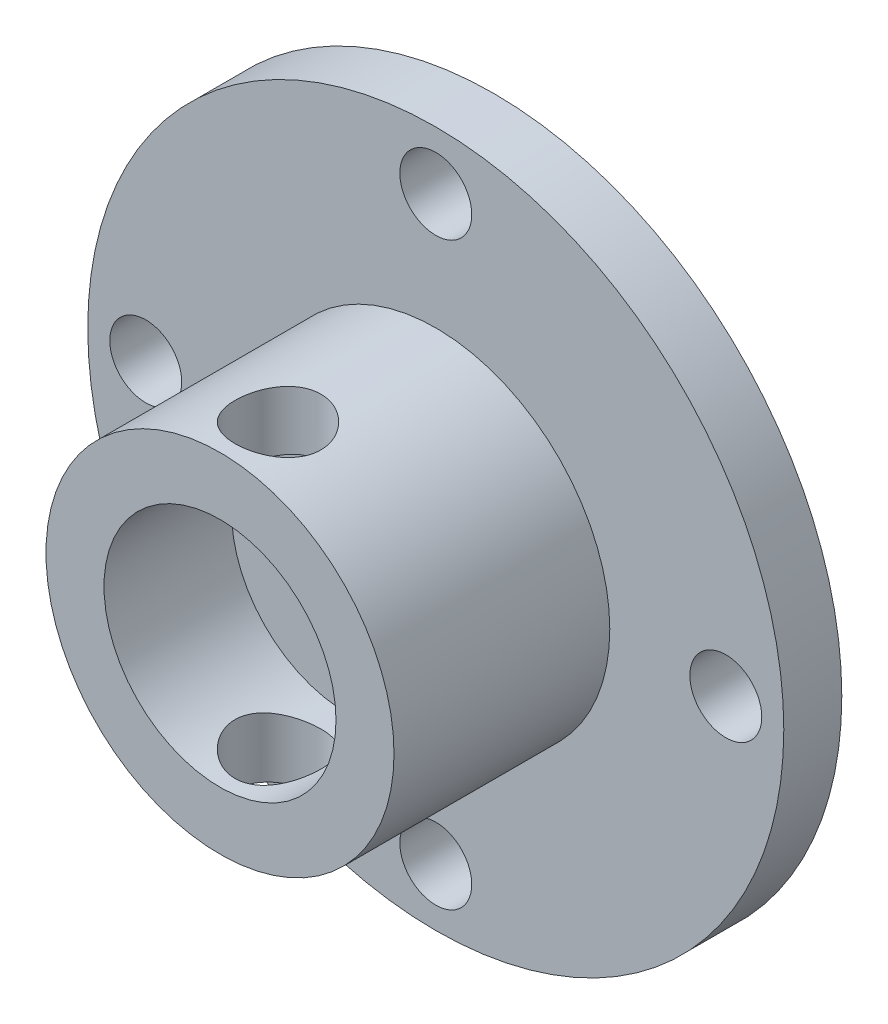
ISO-10303-21;
HEADER;
FILE_DESCRIPTION(('STEP AP214'),'2;1');
FILE_NAME('part.step','',(''),(''),'','','');
FILE_SCHEMA(('AUTOMOTIVE_DESIGN { 1 0 10303 214 1 1 1 1 }'));
ENDSEC;
DATA;
#1=APPLICATION_CONTEXT('core data for automotive mechanical design processes');
#2=APPLICATION_PROTOCOL_DEFINITION('international standard','automotive_design',2000,#1);
#3=PRODUCT_CONTEXT('',#1,'mechanical');
#4=PRODUCT('Part','Part','',(#3));
#5=PRODUCT_RELATED_PRODUCT_CATEGORY('part','',(#4));
#6=PRODUCT_DEFINITION_FORMATION('','',#4);
#7=PRODUCT_DEFINITION_CONTEXT('part definition',#1,'design');
#8=PRODUCT_DEFINITION('design','',#6,#7);
#9=PRODUCT_DEFINITION_SHAPE('','',#8);
#10=(LENGTH_UNIT() NAMED_UNIT(*) SI_UNIT(.MILLI.,.METRE.));
#11=(NAMED_UNIT(*) PLANE_ANGLE_UNIT() SI_UNIT($,.RADIAN.));
#12=(NAMED_UNIT(*) SI_UNIT($,.STERADIAN.) SOLID_ANGLE_UNIT());
#13=UNCERTAINTY_MEASURE_WITH_UNIT(LENGTH_MEASURE(1.E-05),#10,'distance_accuracy_value','');
#14=(GEOMETRIC_REPRESENTATION_CONTEXT(3) GLOBAL_UNCERTAINTY_ASSIGNED_CONTEXT((#13)) GLOBAL_UNIT_ASSIGNED_CONTEXT((#10,
#11,#12)) REPRESENTATION_CONTEXT('',''));
#15=CARTESIAN_POINT('',(0.,0.,0.));
#16=DIRECTION('',(0.,0.,1.));
#17=DIRECTION('',(1.,0.,0.));
#18=AXIS2_PLACEMENT_3D('',#15,#16,#17);
#19=CARTESIAN_POINT('',(0.,0.,0.));
#20=DIRECTION('',(0.,0.,1.));
#21=DIRECTION('',(1.,0.,0.));
#22=AXIS2_PLACEMENT_3D('',#19,#20,#21);
#23=CYLINDRICAL_SURFACE('',#22,2.5);
#24=CARTESIAN_POINT('',(0.,0.,0.));
#25=DIRECTION('',(0.,0.,1.));
#26=DIRECTION('',(1.,0.,0.));
#27=AXIS2_PLACEMENT_3D('',#24,#25,#26);
#28=CIRCLE('',#27,2.5);
#29=CARTESIAN_POINT('',(2.5,0.,0.));
#30=VERTEX_POINT('',#29);
#31=EDGE_CURVE('E65',#30,#30,#28,.T.);
#32=ORIENTED_EDGE('',*,*,#31,.F.);
#33=EDGE_LOOP('',(#32));
#34=FACE_BOUND('',#33,.T.);
#35=CARTESIAN_POINT('',(0.,0.,6.3));
#36=DIRECTION('',(0.,0.,1.));
#37=DIRECTION('',(1.,0.,0.));
#38=AXIS2_PLACEMENT_3D('',#35,#36,#37);
#39=CIRCLE('',#38,2.5);
#40=CARTESIAN_POINT('',(2.5,0.,6.3));
#41=VERTEX_POINT('',#40);
#42=EDGE_CURVE('E62',#41,#41,#39,.F.);
#43=ORIENTED_EDGE('',*,*,#42,.F.);
#44=EDGE_LOOP('',(#43));
#45=FACE_BOUND('',#44,.T.);
#46=ADVANCED_FACE('F35',(#34,#45),#23,.F.);
#47=CARTESIAN_POINT('',(0.,0.,2.5));
#48=DIRECTION('',(0.,0.,1.));
#49=DIRECTION('',(1.,0.,0.));
#50=AXIS2_PLACEMENT_3D('',#47,#48,#49);
#51=PLANE('',#50);
#52=CARTESIAN_POINT('',(0.,0.,2.5));
#53=DIRECTION('',(0.,0.,1.));
#54=DIRECTION('',(1.,0.,0.));
#55=AXIS2_PLACEMENT_3D('',#52,#53,#54);
#56=CIRCLE('',#55,7.5);
#57=CARTESIAN_POINT('',(7.5,0.,2.5));
#58=VERTEX_POINT('',#57);
#59=EDGE_CURVE('E164',#58,#58,#56,.T.);
#60=ORIENTED_EDGE('',*,*,#59,.F.);
#61=EDGE_LOOP('',(#60));
#62=FACE_BOUND('',#61,.T.);
#63=CARTESIAN_POINT('',(0.,-12.5,2.5));
#64=DIRECTION('',(0.,0.,1.));
#65=DIRECTION('',(1.,0.,0.));
#66=AXIS2_PLACEMENT_3D('',#63,#64,#65);
#67=CIRCLE('',#66,1.55);
#68=CARTESIAN_POINT('',(1.55,-12.5,2.5));
#69=VERTEX_POINT('',#68);
#70=EDGE_CURVE('E178',#69,#69,#67,.T.);
#71=ORIENTED_EDGE('',*,*,#70,.F.);
#72=EDGE_LOOP('',(#71));
#73=FACE_BOUND('',#72,.T.);
#74=CARTESIAN_POINT('',(0.,12.5,2.5));
#75=DIRECTION('',(0.,0.,1.));
#76=DIRECTION('',(1.,0.,0.));
#77=AXIS2_PLACEMENT_3D('',#74,#75,#76);
#78=CIRCLE('',#77,1.55);
#79=CARTESIAN_POINT('',(1.55,12.5,2.5));
#80=VERTEX_POINT('',#79);
#81=EDGE_CURVE('E56',#80,#80,#78,.T.);
#82=ORIENTED_EDGE('',*,*,#81,.F.);
#83=EDGE_LOOP('',(#82));
#84=FACE_BOUND('',#83,.T.);
#85=CARTESIAN_POINT('',(0.,0.,2.5));
#86=DIRECTION('',(0.,0.,1.));
#87=DIRECTION('',(1.,0.,0.));
#88=AXIS2_PLACEMENT_3D('',#85,#86,#87);
#89=CIRCLE('',#88,15.);
#90=CARTESIAN_POINT('',(15.,0.,2.5));
#91=VERTEX_POINT('',#90);
#92=EDGE_CURVE('E10',#91,#91,#89,.T.);
#93=ORIENTED_EDGE('',*,*,#92,.T.);
#94=EDGE_LOOP('',(#93));
#95=FACE_BOUND('',#94,.T.);
#96=CARTESIAN_POINT('',(12.5,0.,2.5));
#97=DIRECTION('',(0.,0.,1.));
#98=DIRECTION('',(1.,0.,0.));
#99=AXIS2_PLACEMENT_3D('',#96,#97,#98);
#100=CIRCLE('',#99,1.55);
#101=CARTESIAN_POINT('',(14.05,0.,2.5));
#102=VERTEX_POINT('',#101);
#103=EDGE_CURVE('E184',#102,#102,#100,.T.);
#104=ORIENTED_EDGE('',*,*,#103,.F.);
#105=EDGE_LOOP('',(#104));
#106=FACE_BOUND('',#105,.T.);
#107=CARTESIAN_POINT('',(-12.5,0.,2.5));
#108=DIRECTION('',(0.,0.,1.));
#109=DIRECTION('',(1.,0.,0.));
#110=AXIS2_PLACEMENT_3D('',#107,#108,#109);
#111=CIRCLE('',#110,1.55);
#112=CARTESIAN_POINT('',(-10.95,0.,2.5));
#113=VERTEX_POINT('',#112);
#114=EDGE_CURVE('E172',#113,#113,#111,.T.);
#115=ORIENTED_EDGE('',*,*,#114,.F.);
#116=EDGE_LOOP('',(#115));
#117=FACE_BOUND('',#116,.T.);
#118=ADVANCED_FACE('F124',(#62,#73,#84,#95,#106,#117),#51,.T.);
#119=CARTESIAN_POINT('',(0.,0.,0.));
#120=DIRECTION('',(0.,0.,1.));
#121=DIRECTION('',(1.,0.,0.));
#122=AXIS2_PLACEMENT_3D('',#119,#120,#121);
#123=PLANE('',#122);
#124=ORIENTED_EDGE('',*,*,#31,.T.);
#125=EDGE_LOOP('',(#124));
#126=FACE_BOUND('',#125,.T.);
#127=CARTESIAN_POINT('',(0.,0.,0.));
#128=DIRECTION('',(0.,0.,1.));
#129=DIRECTION('',(1.,0.,0.));
#130=AXIS2_PLACEMENT_3D('',#127,#128,#129);
#131=CIRCLE('',#130,15.);
#132=CARTESIAN_POINT('',(15.,0.,0.));
#133=VERTEX_POINT('',#132);
#134=EDGE_CURVE('E49',#133,#133,#131,.T.);
#135=ORIENTED_EDGE('',*,*,#134,.F.);
#136=EDGE_LOOP('',(#135));
#137=FACE_BOUND('',#136,.T.);
#138=CARTESIAN_POINT('',(0.,12.5,0.));
#139=DIRECTION('',(0.,0.,1.));
#140=DIRECTION('',(1.,0.,0.));
#141=AXIS2_PLACEMENT_3D('',#138,#139,#140);
#142=CIRCLE('',#141,1.55);
#143=CARTESIAN_POINT('',(1.55,12.5,0.));
#144=VERTEX_POINT('',#143);
#145=EDGE_CURVE('E59',#144,#144,#142,.T.);
#146=ORIENTED_EDGE('',*,*,#145,.T.);
#147=EDGE_LOOP('',(#146));
#148=FACE_BOUND('',#147,.T.);
#149=CARTESIAN_POINT('',(12.5,0.,0.));
#150=DIRECTION('',(0.,0.,1.));
#151=DIRECTION('',(1.,0.,0.));
#152=AXIS2_PLACEMENT_3D('',#149,#150,#151);
#153=CIRCLE('',#152,1.55);
#154=CARTESIAN_POINT('',(14.05,0.,0.));
#155=VERTEX_POINT('',#154);
#156=EDGE_CURVE('E181',#155,#155,#153,.T.);
#157=ORIENTED_EDGE('',*,*,#156,.T.);
#158=EDGE_LOOP('',(#157));
#159=FACE_BOUND('',#158,.T.);
#160=CARTESIAN_POINT('',(0.,-12.5,0.));
#161=DIRECTION('',(0.,0.,1.));
#162=DIRECTION('',(1.,0.,0.));
#163=AXIS2_PLACEMENT_3D('',#160,#161,#162);
#164=CIRCLE('',#163,1.55);
#165=CARTESIAN_POINT('',(1.55,-12.5,0.));
#166=VERTEX_POINT('',#165);
#167=EDGE_CURVE('E175',#166,#166,#164,.T.);
#168=ORIENTED_EDGE('',*,*,#167,.T.);
#169=EDGE_LOOP('',(#168));
#170=FACE_BOUND('',#169,.T.);
#171=CARTESIAN_POINT('',(-12.5,0.,0.));
#172=DIRECTION('',(0.,0.,1.));
#173=DIRECTION('',(1.,0.,0.));
#174=AXIS2_PLACEMENT_3D('',#171,#172,#173);
#175=CIRCLE('',#174,1.55);
#176=CARTESIAN_POINT('',(-10.95,0.,0.));
#177=VERTEX_POINT('',#176);
#178=EDGE_CURVE('E169',#177,#177,#175,.T.);
#179=ORIENTED_EDGE('',*,*,#178,.T.);
#180=EDGE_LOOP('',(#179));
#181=FACE_BOUND('',#180,.T.);
#182=ADVANCED_FACE('F126',(#126,#137,#148,#159,#170,#181),#123,.F.);
#183=CARTESIAN_POINT('',(0.,0.,2.5));
#184=DIRECTION('',(0.,0.,-1.));
#185=DIRECTION('',(-1.,0.,0.));
#186=AXIS2_PLACEMENT_3D('',#183,#184,#185);
#187=CYLINDRICAL_SURFACE('',#186,15.);
#188=ORIENTED_EDGE('',*,*,#92,.F.);
#189=EDGE_LOOP('',(#188));
#190=FACE_BOUND('',#189,.T.);
#191=ORIENTED_EDGE('',*,*,#134,.T.);
#192=EDGE_LOOP('',(#191));
#193=FACE_BOUND('',#192,.T.);
#194=ADVANCED_FACE('F37',(#190,#193),#187,.T.);
#195=CARTESIAN_POINT('',(0.,12.5,2.5));
#196=DIRECTION('',(0.,0.,-1.));
#197=DIRECTION('',(-1.,0.,0.));
#198=AXIS2_PLACEMENT_3D('',#195,#196,#197);
#199=CYLINDRICAL_SURFACE('',#198,1.55);
#200=ORIENTED_EDGE('',*,*,#81,.T.);
#201=EDGE_LOOP('',(#200));
#202=FACE_BOUND('',#201,.T.);
#203=ORIENTED_EDGE('',*,*,#145,.F.);
#204=EDGE_LOOP('',(#203));
#205=FACE_BOUND('',#204,.T.);
#206=ADVANCED_FACE('F119',(#202,#205),#199,.F.);
#207=CARTESIAN_POINT('',(12.5,0.,2.5));
#208=DIRECTION('',(0.,0.,-1.));
#209=DIRECTION('',(-1.,0.,0.));
#210=AXIS2_PLACEMENT_3D('',#207,#208,#209);
#211=CYLINDRICAL_SURFACE('',#210,1.55);
#212=ORIENTED_EDGE('',*,*,#103,.T.);
#213=EDGE_LOOP('',(#212));
#214=FACE_BOUND('',#213,.T.);
#215=ORIENTED_EDGE('',*,*,#156,.F.);
#216=EDGE_LOOP('',(#215));
#217=FACE_BOUND('',#216,.T.);
#218=ADVANCED_FACE('F115',(#214,#217),#211,.F.);
#219=CARTESIAN_POINT('',(0.,-12.5,2.5));
#220=DIRECTION('',(0.,0.,-1.));
#221=DIRECTION('',(-1.,0.,0.));
#222=AXIS2_PLACEMENT_3D('',#219,#220,#221);
#223=CYLINDRICAL_SURFACE('',#222,1.55);
#224=ORIENTED_EDGE('',*,*,#70,.T.);
#225=EDGE_LOOP('',(#224));
#226=FACE_BOUND('',#225,.T.);
#227=ORIENTED_EDGE('',*,*,#167,.F.);
#228=EDGE_LOOP('',(#227));
#229=FACE_BOUND('',#228,.T.);
#230=ADVANCED_FACE('F111',(#226,#229),#223,.F.);
#231=CARTESIAN_POINT('',(-12.5,0.,2.5));
#232=DIRECTION('',(0.,0.,-1.));
#233=DIRECTION('',(-1.,0.,0.));
#234=AXIS2_PLACEMENT_3D('',#231,#232,#233);
#235=CYLINDRICAL_SURFACE('',#234,1.55);
#236=ORIENTED_EDGE('',*,*,#114,.T.);
#237=EDGE_LOOP('',(#236));
#238=FACE_BOUND('',#237,.T.);
#239=ORIENTED_EDGE('',*,*,#178,.F.);
#240=EDGE_LOOP('',(#239));
#241=FACE_BOUND('',#240,.T.);
#242=ADVANCED_FACE('F106',(#238,#241),#235,.F.);
#243=CARTESIAN_POINT('',(0.,0.,11.8));
#244=DIRECTION('',(0.,0.,-1.));
#245=DIRECTION('',(-1.,0.,0.));
#246=AXIS2_PLACEMENT_3D('',#243,#244,#245);
#247=CYLINDRICAL_SURFACE('',#246,7.5);
#248=CARTESIAN_POINT('',(0.,-7.5,11.15));
#249=CARTESIAN_POINT('',(0.102257910479826,-7.49999824295414,11.1499970519667));
#250=CARTESIAN_POINT('',(0.20454903196265,-7.49788778036294,11.1414930747045));
#251=CARTESIAN_POINT('',(0.40620253151472,-7.48967314699856,11.1077510305987));
#252=CARTESIAN_POINT('',(0.505563165783449,-7.48356664654784,11.0825032020267));
#253=CARTESIAN_POINT('',(0.698414265934517,-7.46803655659658,11.0161305826201));
#254=CARTESIAN_POINT('',(0.791911527856707,-7.45861689425126,10.9750245832221));
#255=CARTESIAN_POINT('',(0.970682819697713,-7.4374651801424,10.8781678743791));
#256=CARTESIAN_POINT('',(1.05595662568287,-7.42573306543474,10.8224167662856));
#257=CARTESIAN_POINT('',(1.21757385011625,-7.40096790331285,10.6966691357199));
#258=CARTESIAN_POINT('',(1.29372851893109,-7.38791521295484,10.6264338779212));
#259=CARTESIAN_POINT('',(1.43330565533689,-7.36211138423451,10.4742229583371));
#260=CARTESIAN_POINT('',(1.496726721985,-7.34936027918842,10.3922460064359));
#261=CARTESIAN_POINT('',(1.60991785355993,-7.32540583462973,10.2174210356183));
#262=CARTESIAN_POINT('',(1.65947792636137,-7.31422746001057,10.1244333254659));
#263=CARTESIAN_POINT('',(1.74219020873844,-7.29497011934171,9.93112632635994));
#264=CARTESIAN_POINT('',(1.77534496530544,-7.28689067221486,9.8308081782637));
#265=CARTESIAN_POINT('',(1.82366381402926,-7.27494766657494,9.62776043271913));
#266=CARTESIAN_POINT('',(1.83916671647664,-7.27100483040903,9.52511623167559));
#267=CARTESIAN_POINT('',(1.85279692972552,-7.26754408231744,9.3186140213083));
#268=CARTESIAN_POINT('',(1.85092698788437,-7.26802547074074,9.21475620650092));
#269=CARTESIAN_POINT('',(1.83013517601895,-7.27328746001133,9.01136264915752));
#270=CARTESIAN_POINT('',(1.81161586924719,-7.27796655921002,8.91178272007097));
#271=CARTESIAN_POINT('',(1.75869270398398,-7.29093513967999,8.71718860258857));
#272=CARTESIAN_POINT('',(1.72428774062401,-7.29922487207333,8.62217473227575));
#273=CARTESIAN_POINT('',(1.64022388441984,-7.31857460354665,8.43832452393676));
#274=CARTESIAN_POINT('',(1.59041792260187,-7.32966111333196,8.34955833914963));
#275=CARTESIAN_POINT('',(1.4770687917597,-7.3533401213509,8.18149863155605));
#276=CARTESIAN_POINT('',(1.41352327766467,-7.36593287650679,8.10220672941442));
#277=CARTESIAN_POINT('',(1.2724084748946,-7.39163378721455,7.95303819440663));
#278=CARTESIAN_POINT('',(1.19449916874534,-7.40474655155395,7.88348362094845));
#279=CARTESIAN_POINT('',(1.02796585650085,-7.42969476630227,7.75836675275426));
#280=CARTESIAN_POINT('',(0.93934154006391,-7.44153017969614,7.70280486343586));
#281=CARTESIAN_POINT('',(0.753441913971892,-7.46264655693543,7.60713673640643));
#282=CARTESIAN_POINT('',(0.656139245029093,-7.47191903524421,7.56708166844709));
#283=CARTESIAN_POINT('',(0.455902201683512,-7.48680296323915,7.50398594022086));
#284=CARTESIAN_POINT('',(0.352968879031617,-7.49241509412849,7.48094211399839));
#285=CARTESIAN_POINT('',(0.147146976061054,-7.49924561619588,7.4530122026846));
#286=CARTESIAN_POINT('',(0.0443213661351338,-7.50057014606747,7.44768739184198));
#287=CARTESIAN_POINT('',(-0.160751491634998,-7.49897798133532,7.45414495022413));
#288=CARTESIAN_POINT('',(-0.262998789287954,-7.49606165774777,7.46592582293743));
#289=CARTESIAN_POINT('',(-0.462496021028146,-7.48638337305809,7.50589841526457));
#290=CARTESIAN_POINT('',(-0.559796659816322,-7.47967728807476,7.53385182673541));
#291=CARTESIAN_POINT('',(-0.748323311129426,-7.46317458647858,7.60510466845537));
#292=CARTESIAN_POINT('',(-0.839548718660182,-7.45337766262417,7.64840562436368));
#293=CARTESIAN_POINT('',(-1.0150886712945,-7.43152484817932,7.74998177825583));
#294=CARTESIAN_POINT('',(-1.09925561568829,-7.41943266861408,7.80850406067196));
#295=CARTESIAN_POINT('',(-1.25673029499529,-7.39438960634957,7.93854476733449));
#296=CARTESIAN_POINT('',(-1.33003620440483,-7.38143857982517,8.01006537182806));
#297=CARTESIAN_POINT('',(-1.46550780910428,-7.35575710926278,8.16610718270468));
#298=CARTESIAN_POINT('',(-1.52736614408201,-7.34303929112846,8.25089775005045));
#299=CARTESIAN_POINT('',(-1.63597441434818,-7.31960973682379,8.42991583076749));
#300=CARTESIAN_POINT('',(-1.68272502360251,-7.30889791117372,8.52414292292327));
#301=CARTESIAN_POINT('',(-1.75944481406043,-7.29080985093324,8.71885035814761));
#302=CARTESIAN_POINT('',(-1.78951341161236,-7.28341390720069,8.81928960245305));
#303=CARTESIAN_POINT('',(-1.83228176291007,-7.27277377213382,9.0240072087239));
#304=CARTESIAN_POINT('',(-1.84498519556836,-7.26952870142196,9.12828475271409));
#305=CARTESIAN_POINT('',(-1.85247425085079,-7.26762348863969,9.33459465759064));
#306=CARTESIAN_POINT('',(-1.84775063959295,-7.26883776171647,9.43660833293867));
#307=CARTESIAN_POINT('',(-1.82163996061756,-7.27542477231368,9.63833653029744));
#308=CARTESIAN_POINT('',(-1.80025321077042,-7.28079743050767,9.73805109612923));
#309=CARTESIAN_POINT('',(-1.74168807438864,-7.2950268024473,9.93183311565289));
#310=CARTESIAN_POINT('',(-1.7045994268666,-7.30386369657108,10.0259292454499));
#311=CARTESIAN_POINT('',(-1.61575472825178,-7.32402912133551,10.2066295698822));
#312=CARTESIAN_POINT('',(-1.56399669666835,-7.33535798836726,10.2932327508441));
#313=CARTESIAN_POINT('',(-1.44573388788173,-7.35959092592686,10.4588658354002));
#314=CARTESIAN_POINT('',(-1.37888751934887,-7.37252773202033,10.5376470934466));
#315=CARTESIAN_POINT('',(-1.23301429169484,-7.39832088695137,10.6830339116122));
#316=CARTESIAN_POINT('',(-1.15398455558483,-7.41117721603691,10.7496365877304));
#317=CARTESIAN_POINT('',(-0.984318639082236,-7.4356292199699,10.8699101814873));
#318=CARTESIAN_POINT('',(-0.893503534128934,-7.44719889328399,10.9233343710024));
#319=CARTESIAN_POINT('',(-0.703905193205619,-7.46750141912264,11.0140726131946));
#320=CARTESIAN_POINT('',(-0.605127842139121,-7.47623634324361,11.0513984369322));
#321=CARTESIAN_POINT('',(-0.422077593559151,-7.488563211195,11.1032124888057));
#322=CARTESIAN_POINT('',(-0.33869138054629,-7.49282288309609,11.1207204034843));
#323=CARTESIAN_POINT('',(-0.17021103377377,-7.49854190911011,11.1441149724723));
#324=CARTESIAN_POINT('',(-0.0851170220030718,-7.50000146252266,11.150002453872));
#325=CARTESIAN_POINT('',(0.,-7.5,11.15));
#326=B_SPLINE_CURVE_WITH_KNOTS('',3,(#248,#249,#250,#251,#252,#253,#254,#255,#256,#257,#258,
#259,#260,#261,#262,#263,#264,#265,#266,#267,#268,#269,#270,#271,#272,#273,#274,#275,#276,#277,
#278,#279,#280,#281,#282,#283,#284,#285,#286,#287,#288,#289,#290,#291,#292,#293,#294,#295,#296,
#297,#298,#299,#300,#301,#302,#303,#304,#305,#306,#307,#308,#309,#310,#311,#312,#313,#314,#315,
#316,#317,#318,#319,#320,#321,#322,#323,#324,#325),.UNSPECIFIED.,.T.,.F.,(4,2,2,2,2,2,2,2,2,2,2,
2,2,2,2,2,2,2,2,2,2,2,2,2,2,2,2,2,2,2,2,2,2,2,2,2,2,2,4),(0.,0.306461850597551,0.61310252685732,
0.919380954083594,1.22566771925125,1.53747718840776,1.84932094386949,2.16566062271075,
2.48195117312166,2.79206270242676,3.10212519124829,3.40488655381488,3.7076689770092,
4.01343704399872,4.31925734082749,4.63355808436665,4.94786793326422,5.26320628375929,
5.57848593195077,5.88589870504856,6.19328458538731,6.49625238440906,6.79925030911678,
7.10751235327141,7.41582615093433,7.73149256187204,8.04714488877228,8.36089530684673,
8.67457924473911,8.97949777134609,9.28441048138945,9.58760360018135,9.89083767211782,
10.2017843063144,10.512804480457,10.8292680228013,11.1454997743463,11.4006093964638,
11.6557008603713),.UNSPECIFIED.);
#327=CARTESIAN_POINT('',(0.,-7.5,11.15));
#328=VERTEX_POINT('',#327);
#329=EDGE_CURVE('E95',#328,#328,#326,.T.);
#330=ORIENTED_EDGE('',*,*,#329,.T.);
#331=EDGE_LOOP('',(#330));
#332=FACE_BOUND('',#331,.T.);
#333=CARTESIAN_POINT('',(0.,7.5,11.15));
#334=CARTESIAN_POINT('',(-0.102257910479826,7.49999824295414,11.1499970519667));
#335=CARTESIAN_POINT('',(-0.20454903196265,7.49788778036294,11.1414930747045));
#336=CARTESIAN_POINT('',(-0.40620253151472,7.48967314699856,11.1077510305987));
#337=CARTESIAN_POINT('',(-0.505563165783449,7.48356664654784,11.0825032020267));
#338=CARTESIAN_POINT('',(-0.698414265934517,7.46803655659658,11.0161305826201));
#339=CARTESIAN_POINT('',(-0.791911527856707,7.45861689425126,10.9750245832221));
#340=CARTESIAN_POINT('',(-0.970682819697713,7.4374651801424,10.8781678743791));
#341=CARTESIAN_POINT('',(-1.05595662568287,7.42573306543474,10.8224167662856));
#342=CARTESIAN_POINT('',(-1.21757385011625,7.40096790331285,10.6966691357199));
#343=CARTESIAN_POINT('',(-1.29372851893109,7.38791521295484,10.6264338779212));
#344=CARTESIAN_POINT('',(-1.43330565533689,7.36211138423451,10.4742229583371));
#345=CARTESIAN_POINT('',(-1.496726721985,7.34936027918842,10.3922460064359));
#346=CARTESIAN_POINT('',(-1.60991785355993,7.32540583462973,10.2174210356183));
#347=CARTESIAN_POINT('',(-1.65947792636137,7.31422746001057,10.1244333254659));
#348=CARTESIAN_POINT('',(-1.74219020873844,7.29497011934171,9.93112632635994));
#349=CARTESIAN_POINT('',(-1.77534496530544,7.28689067221486,9.8308081782637));
#350=CARTESIAN_POINT('',(-1.82366381402926,7.27494766657494,9.62776043271913));
#351=CARTESIAN_POINT('',(-1.83916671647664,7.27100483040903,9.52511623167559));
#352=CARTESIAN_POINT('',(-1.85279692972552,7.26754408231744,9.3186140213083));
#353=CARTESIAN_POINT('',(-1.85092698788437,7.26802547074074,9.21475620650092));
#354=CARTESIAN_POINT('',(-1.83013517601895,7.27328746001133,9.01136264915752));
#355=CARTESIAN_POINT('',(-1.81161586924719,7.27796655921002,8.91178272007097));
#356=CARTESIAN_POINT('',(-1.75869270398398,7.29093513967999,8.71718860258857));
#357=CARTESIAN_POINT('',(-1.72428774062401,7.29922487207333,8.62217473227575));
#358=CARTESIAN_POINT('',(-1.64022388441984,7.31857460354665,8.43832452393676));
#359=CARTESIAN_POINT('',(-1.59041792260187,7.32966111333196,8.34955833914963));
#360=CARTESIAN_POINT('',(-1.4770687917597,7.3533401213509,8.18149863155605));
#361=CARTESIAN_POINT('',(-1.41352327766467,7.36593287650679,8.10220672941442));
#362=CARTESIAN_POINT('',(-1.2724084748946,7.39163378721455,7.95303819440663));
#363=CARTESIAN_POINT('',(-1.19449916874534,7.40474655155395,7.88348362094845));
#364=CARTESIAN_POINT('',(-1.02796585650085,7.42969476630227,7.75836675275426));
#365=CARTESIAN_POINT('',(-0.93934154006391,7.44153017969614,7.70280486343586));
#366=CARTESIAN_POINT('',(-0.753441913971892,7.46264655693543,7.60713673640643));
#367=CARTESIAN_POINT('',(-0.656139245029093,7.47191903524421,7.56708166844709));
#368=CARTESIAN_POINT('',(-0.455902201683512,7.48680296323915,7.50398594022086));
#369=CARTESIAN_POINT('',(-0.352968879031617,7.49241509412849,7.48094211399839));
#370=CARTESIAN_POINT('',(-0.147146976061054,7.49924561619588,7.4530122026846));
#371=CARTESIAN_POINT('',(-0.0443213661351338,7.50057014606747,7.44768739184198));
#372=CARTESIAN_POINT('',(0.160751491634998,7.49897798133532,7.45414495022413));
#373=CARTESIAN_POINT('',(0.262998789287954,7.49606165774777,7.46592582293743));
#374=CARTESIAN_POINT('',(0.462496021028146,7.48638337305809,7.50589841526457));
#375=CARTESIAN_POINT('',(0.559796659816322,7.47967728807476,7.53385182673541));
#376=CARTESIAN_POINT('',(0.748323311129426,7.46317458647858,7.60510466845537));
#377=CARTESIAN_POINT('',(0.839548718660182,7.45337766262417,7.64840562436368));
#378=CARTESIAN_POINT('',(1.0150886712945,7.43152484817932,7.74998177825583));
#379=CARTESIAN_POINT('',(1.09925561568829,7.41943266861408,7.80850406067196));
#380=CARTESIAN_POINT('',(1.25673029499529,7.39438960634957,7.93854476733449));
#381=CARTESIAN_POINT('',(1.33003620440483,7.38143857982517,8.01006537182806));
#382=CARTESIAN_POINT('',(1.46550780910428,7.35575710926278,8.16610718270468));
#383=CARTESIAN_POINT('',(1.52736614408201,7.34303929112846,8.25089775005045));
#384=CARTESIAN_POINT('',(1.63597441434818,7.31960973682379,8.42991583076749));
#385=CARTESIAN_POINT('',(1.68272502360251,7.30889791117372,8.52414292292327));
#386=CARTESIAN_POINT('',(1.75944481406043,7.29080985093324,8.71885035814761));
#387=CARTESIAN_POINT('',(1.78951341161236,7.28341390720069,8.81928960245305));
#388=CARTESIAN_POINT('',(1.83228176291007,7.27277377213382,9.0240072087239));
#389=CARTESIAN_POINT('',(1.84498519556836,7.26952870142196,9.12828475271409));
#390=CARTESIAN_POINT('',(1.85247425085079,7.26762348863969,9.33459465759064));
#391=CARTESIAN_POINT('',(1.84775063959295,7.26883776171647,9.43660833293867));
#392=CARTESIAN_POINT('',(1.82163996061756,7.27542477231368,9.63833653029744));
#393=CARTESIAN_POINT('',(1.80025321077042,7.28079743050767,9.73805109612923));
#394=CARTESIAN_POINT('',(1.74168807438864,7.2950268024473,9.93183311565289));
#395=CARTESIAN_POINT('',(1.7045994268666,7.30386369657108,10.0259292454499));
#396=CARTESIAN_POINT('',(1.61575472825178,7.32402912133551,10.2066295698822));
#397=CARTESIAN_POINT('',(1.56399669666835,7.33535798836726,10.2932327508441));
#398=CARTESIAN_POINT('',(1.44573388788173,7.35959092592686,10.4588658354002));
#399=CARTESIAN_POINT('',(1.37888751934887,7.37252773202033,10.5376470934466));
#400=CARTESIAN_POINT('',(1.23301429169484,7.39832088695137,10.6830339116122));
#401=CARTESIAN_POINT('',(1.15398455558483,7.41117721603691,10.7496365877304));
#402=CARTESIAN_POINT('',(0.984318639082236,7.4356292199699,10.8699101814873));
#403=CARTESIAN_POINT('',(0.893503534128934,7.44719889328399,10.9233343710024));
#404=CARTESIAN_POINT('',(0.703905193205619,7.46750141912264,11.0140726131946));
#405=CARTESIAN_POINT('',(0.605127842139121,7.47623634324361,11.0513984369322));
#406=CARTESIAN_POINT('',(0.422077593559151,7.488563211195,11.1032124888057));
#407=CARTESIAN_POINT('',(0.33869138054629,7.49282288309609,11.1207204034843));
#408=CARTESIAN_POINT('',(0.17021103377377,7.49854190911011,11.1441149724723));
#409=CARTESIAN_POINT('',(0.0851170220030718,7.50000146252266,11.150002453872));
#410=CARTESIAN_POINT('',(0.,7.5,11.15));
#411=B_SPLINE_CURVE_WITH_KNOTS('',3,(#333,#334,#335,#336,#337,#338,#339,#340,#341,#342,#343,
#344,#345,#346,#347,#348,#349,#350,#351,#352,#353,#354,#355,#356,#357,#358,#359,#360,#361,#362,
#363,#364,#365,#366,#367,#368,#369,#370,#371,#372,#373,#374,#375,#376,#377,#378,#379,#380,#381,
#382,#383,#384,#385,#386,#387,#388,#389,#390,#391,#392,#393,#394,#395,#396,#397,#398,#399,#400,
#401,#402,#403,#404,#405,#406,#407,#408,#409,#410),.UNSPECIFIED.,.T.,.F.,(4,2,2,2,2,2,2,2,2,2,2,
2,2,2,2,2,2,2,2,2,2,2,2,2,2,2,2,2,2,2,2,2,2,2,2,2,2,2,4),(0.,0.306461850597551,0.61310252685732,
0.919380954083594,1.22566771925125,1.53747718840776,1.84932094386949,2.16566062271075,
2.48195117312166,2.79206270242676,3.10212519124829,3.40488655381488,3.7076689770092,
4.01343704399872,4.31925734082749,4.63355808436665,4.94786793326422,5.26320628375929,
5.57848593195077,5.88589870504856,6.19328458538731,6.49625238440906,6.79925030911678,
7.10751235327141,7.41582615093433,7.73149256187204,8.04714488877228,8.36089530684673,
8.67457924473911,8.97949777134609,9.28441048138945,9.58760360018135,9.89083767211782,
10.2017843063144,10.512804480457,10.8292680228013,11.1454997743463,11.4006093964638,
11.6557008603713),.UNSPECIFIED.);
#412=CARTESIAN_POINT('',(0.,7.5,11.15));
#413=VERTEX_POINT('',#412);
#414=EDGE_CURVE('E88',#413,#413,#411,.T.);
#415=ORIENTED_EDGE('',*,*,#414,.T.);
#416=EDGE_LOOP('',(#415));
#417=FACE_BOUND('',#416,.T.);
#418=CARTESIAN_POINT('',(0.,0.,11.8));
#419=DIRECTION('',(0.,0.,1.));
#420=DIRECTION('',(1.,0.,0.));
#421=AXIS2_PLACEMENT_3D('',#418,#419,#420);
#422=CIRCLE('',#421,7.5);
#423=CARTESIAN_POINT('',(7.5,0.,11.8));
#424=VERTEX_POINT('',#423);
#425=EDGE_CURVE('E165',#424,#424,#422,.T.);
#426=ORIENTED_EDGE('',*,*,#425,.F.);
#427=EDGE_LOOP('',(#426));
#428=FACE_BOUND('',#427,.T.);
#429=ORIENTED_EDGE('',*,*,#59,.T.);
#430=EDGE_LOOP('',(#429));
#431=FACE_BOUND('',#430,.T.);
#432=ADVANCED_FACE('F100',(#332,#417,#428,#431),#247,.T.);
#433=CARTESIAN_POINT('',(0.,0.,11.8));
#434=DIRECTION('',(0.,0.,1.));
#435=DIRECTION('',(1.,0.,0.));
#436=AXIS2_PLACEMENT_3D('',#433,#434,#435);
#437=PLANE('',#436);
#438=CARTESIAN_POINT('',(0.,0.,11.8));
#439=DIRECTION('',(0.,0.,1.));
#440=DIRECTION('',(1.,0.,0.));
#441=AXIS2_PLACEMENT_3D('',#438,#439,#440);
#442=CIRCLE('',#441,5.);
#443=CARTESIAN_POINT('',(5.,0.,11.8));
#444=VERTEX_POINT('',#443);
#445=EDGE_CURVE('E156',#444,#444,#442,.T.);
#446=ORIENTED_EDGE('',*,*,#445,.F.);
#447=EDGE_LOOP('',(#446));
#448=FACE_BOUND('',#447,.T.);
#449=ORIENTED_EDGE('',*,*,#425,.T.);
#450=EDGE_LOOP('',(#449));
#451=FACE_BOUND('',#450,.T.);
#452=ADVANCED_FACE('F105',(#448,#451),#437,.T.);
#453=CARTESIAN_POINT('',(0.,0.,6.3));
#454=DIRECTION('',(0.,0.,1.));
#455=DIRECTION('',(1.,0.,0.));
#456=AXIS2_PLACEMENT_3D('',#453,#454,#455);
#457=PLANE('',#456);
#458=CARTESIAN_POINT('',(0.,0.,6.3));
#459=DIRECTION('',(0.,0.,1.));
#460=DIRECTION('',(1.,0.,0.));
#461=AXIS2_PLACEMENT_3D('',#458,#459,#460);
#462=CIRCLE('',#461,5.);
#463=CARTESIAN_POINT('',(5.,0.,6.3));
#464=VERTEX_POINT('',#463);
#465=EDGE_CURVE('E66',#464,#464,#462,.T.);
#466=ORIENTED_EDGE('',*,*,#465,.T.);
#467=EDGE_LOOP('',(#466));
#468=FACE_BOUND('',#467,.T.);
#469=ORIENTED_EDGE('',*,*,#42,.T.);
#470=EDGE_LOOP('',(#469));
#471=FACE_BOUND('',#470,.T.);
#472=ADVANCED_FACE('F82',(#468,#471),#457,.T.);
#473=CARTESIAN_POINT('',(0.,0.,6.3));
#474=DIRECTION('',(0.,0.,1.));
#475=DIRECTION('',(1.,0.,0.));
#476=AXIS2_PLACEMENT_3D('',#473,#474,#475);
#477=CYLINDRICAL_SURFACE('',#476,5.);
#478=CARTESIAN_POINT('',(0.,-5.,11.15));
#479=CARTESIAN_POINT('',(-0.100284084774487,-5.0000023261255,11.1500031361891));
#480=CARTESIAN_POINT('',(-0.200546410441359,-4.99695647304915,11.1418201200566));
#481=CARTESIAN_POINT('',(-0.398079870662185,-4.9851097748076,11.1094326206099));
#482=CARTESIAN_POINT('',(-0.495351346570617,-4.97630958897322,11.0852299728195));
#483=CARTESIAN_POINT('',(-0.684026139388052,-4.95390031475895,11.0217728441783));
#484=CARTESIAN_POINT('',(-0.775440208766535,-4.94030035466208,10.9825469228344));
#485=CARTESIAN_POINT('',(-0.950385169849417,-4.90965024263756,10.8902999672178));
#486=CARTESIAN_POINT('',(-1.03391400010755,-4.89259919213059,10.8372753390708));
#487=CARTESIAN_POINT('',(-1.19418485904377,-4.85602045298067,10.7166354718069));
#488=CARTESIAN_POINT('',(-1.27055595388408,-4.83642396346569,10.6485484920015));
#489=CARTESIAN_POINT('',(-1.41109266975359,-4.79730639740445,10.5007181989904));
#490=CARTESIAN_POINT('',(-1.47525469720585,-4.77778534471327,10.4209714660672));
#491=CARTESIAN_POINT('',(-1.59187972440724,-4.74023398829962,10.2484971304435));
#492=CARTESIAN_POINT('',(-1.64382403259057,-4.72228520795613,10.1553992757661));
#493=CARTESIAN_POINT('',(-1.73115354103066,-4.69097811450883,9.96101965910421));
#494=CARTESIAN_POINT('',(-1.76654515599026,-4.67761802367381,9.85974108528593));
#495=CARTESIAN_POINT('',(-1.81830928179787,-4.65773517149156,9.65613954809779));
#496=CARTESIAN_POINT('',(-1.83538824724204,-4.65095946745573,9.55402171771151));
#497=CARTESIAN_POINT('',(-1.85225123739208,-4.64427130024109,9.34816206540569));
#498=CARTESIAN_POINT('',(-1.85204216395023,-4.64435609816422,9.24442090809992));
#499=CARTESIAN_POINT('',(-1.83487623917832,-4.65116080730034,9.04466516813075));
#500=CARTESIAN_POINT('',(-1.81889170648085,-4.65749549993529,8.94855149212674));
#501=CARTESIAN_POINT('',(-1.77223333797425,-4.6754472802492,8.76048222561288));
#502=CARTESIAN_POINT('',(-1.74155734952121,-4.68706514202414,8.66852724661162));
#503=CARTESIAN_POINT('',(-1.66584045537477,-4.71451134200534,8.48937582511793));
#504=CARTESIAN_POINT('',(-1.62054297350463,-4.73041397615237,8.40229970500331));
#505=CARTESIAN_POINT('',(-1.51704763617226,-4.7646123620014,8.23669923159955));
#506=CARTESIAN_POINT('',(-1.45884541096612,-4.78290892346163,8.15817778851899));
#507=CARTESIAN_POINT('',(-1.32671679219375,-4.8212912463788,8.006522793253));
#508=CARTESIAN_POINT('',(-1.25201187852221,-4.8414158309533,7.93407572231732));
#509=CARTESIAN_POINT('',(-1.09127900483326,-4.88015748995558,7.80253680194204));
#510=CARTESIAN_POINT('',(-1.00524939844048,-4.89877434455383,7.74344689775782));
#511=CARTESIAN_POINT('',(-0.822595565458688,-4.93275576295935,7.63956927301467));
#512=CARTESIAN_POINT('',(-0.725834208493699,-4.94806850478758,7.59500452271827));
#513=CARTESIAN_POINT('',(-0.525480766646744,-4.973333152961,7.52301172614305));
#514=CARTESIAN_POINT('',(-0.421891653340174,-4.98328737437346,7.49557627858936));
#515=CARTESIAN_POINT('',(-0.216605061453891,-4.99630939140948,7.45992751903703));
#516=CARTESIAN_POINT('',(-0.11508901437033,-4.99970816165239,7.45078941019585));
#517=CARTESIAN_POINT('',(0.0880707915454907,-5.00025533922452,7.44930923735572));
#518=CARTESIAN_POINT('',(0.18971451826251,-4.99740508893489,7.45696356609541));
#519=CARTESIAN_POINT('',(0.386285261599515,-4.98599298592196,7.48814410261097));
#520=CARTESIAN_POINT('',(0.481321481836752,-4.9776475445006,7.51106929688496));
#521=CARTESIAN_POINT('',(0.666135560997871,-4.95630143552351,7.57135450125162));
#522=CARTESIAN_POINT('',(0.75591273393634,-4.94330016223158,7.60871638964687));
#523=CARTESIAN_POINT('',(0.930583736380057,-4.91346078961708,7.69799685016286));
#524=CARTESIAN_POINT('',(1.01525965424343,-4.89652211466873,7.7503071164241));
#525=CARTESIAN_POINT('',(1.1749119949649,-4.8606879453448,7.86755469896125));
#526=CARTESIAN_POINT('',(1.24988488905478,-4.84179174353441,7.93249658769939));
#527=CARTESIAN_POINT('',(1.39242733151067,-4.80280275753813,8.0774808309706));
#528=CARTESIAN_POINT('',(1.45934002677394,-4.78270264246215,8.15816867526));
#529=CARTESIAN_POINT('',(1.57879921200934,-4.74461124802929,8.33002878528573));
#530=CARTESIAN_POINT('',(1.63134459108016,-4.72662013180461,8.4212018609812));
#531=CARTESIAN_POINT('',(1.72058505758046,-4.6948748522726,8.61209213440771));
#532=CARTESIAN_POINT('',(1.75722864068045,-4.68113449740698,8.71183586034496));
#533=CARTESIAN_POINT('',(1.81296846132271,-4.65983400867698,8.91672568552799));
#534=CARTESIAN_POINT('',(1.83207516444389,-4.65227018910589,9.02186852310082));
#535=CARTESIAN_POINT('',(1.85127719703179,-4.64466028741445,9.22747585948862));
#536=CARTESIAN_POINT('',(1.85248877739671,-4.64417283501872,9.3278206748614));
#537=CARTESIAN_POINT('',(1.83871194896512,-4.64964431391935,9.52720324193533));
#538=CARTESIAN_POINT('',(1.8237249935843,-4.65560266686504,9.62624111009548));
#539=CARTESIAN_POINT('',(1.77883661621482,-4.6729315751677,9.81729767459018));
#540=CARTESIAN_POINT('',(1.74937899558642,-4.68414064800605,9.90943652855228));
#541=CARTESIAN_POINT('',(1.67677199320687,-4.71061796531584,10.0875206665062));
#542=CARTESIAN_POINT('',(1.63361919475724,-4.72588722257533,10.1734643983544));
#543=CARTESIAN_POINT('',(1.53227080766042,-4.75974121101372,10.3415198593613));
#544=CARTESIAN_POINT('',(1.47341599915466,-4.77845602146117,10.4232075297505));
#545=CARTESIAN_POINT('',(1.3433662067603,-4.81663324344531,10.5759043909687));
#546=CARTESIAN_POINT('',(1.27216735430204,-4.83609588785707,10.646910221087));
#547=CARTESIAN_POINT('',(1.1150128370639,-4.8747941995836,10.7799957611771));
#548=CARTESIAN_POINT('',(1.02848150372602,-4.8939651805914,10.8414174554694));
#549=CARTESIAN_POINT('',(0.84565495629763,-4.92884564567557,10.9488196092569));
#550=CARTESIAN_POINT('',(0.749359418929154,-4.94455501508856,10.9947995572818));
#551=CARTESIAN_POINT('',(0.546409769695066,-4.97113918589608,11.0708884515798));
#552=CARTESIAN_POINT('',(0.439522205634705,-4.98184237830792,11.1004398123131));
#553=CARTESIAN_POINT('',(0.221746300132397,-4.99626986743311,11.1399892799381));
#554=CARTESIAN_POINT('',(0.110859854842011,-4.9999974285657,11.1499965330743));
#555=CARTESIAN_POINT('',(0.,-5.,11.15));
#556=B_SPLINE_CURVE_WITH_KNOTS('',3,(#478,#479,#480,#481,#482,#483,#484,#485,#486,#487,#488,
#489,#490,#491,#492,#493,#494,#495,#496,#497,#498,#499,#500,#501,#502,#503,#504,#505,#506,#507,
#508,#509,#510,#511,#512,#513,#514,#515,#516,#517,#518,#519,#520,#521,#522,#523,#524,#525,#526,
#527,#528,#529,#530,#531,#532,#533,#534,#535,#536,#537,#538,#539,#540,#541,#542,#543,#544,#545,
#546,#547,#548,#549,#550,#551,#552,#553,#554,#555),.UNSPECIFIED.,.T.,.F.,(4,2,2,2,2,2,2,2,2,2,2,
2,2,2,2,2,2,2,2,2,2,2,2,2,2,2,2,2,2,2,2,2,2,2,2,2,2,2,4),(0.,0.300443460514757,
0.600852502280719,0.90069327326771,1.20061221610629,1.5117543545181,1.82298793230787,
2.14569909307551,2.46828508901665,2.77792145774429,3.08743421186346,3.37899071990013,
3.67058996090079,3.96761297823752,4.26473672614032,4.58125941558457,4.89782817178553,
5.21904968788627,5.54013231350849,5.84452979836619,6.14886190059208,6.44187308488916,
6.73492240458445,7.03649314235408,7.33817324815645,7.65688367930857,7.97561874663996,
8.29537859685008,8.61494749793208,8.91449189613469,9.21400941990889,9.50486602806217,
9.79579525678184,10.1016790271148,10.4076588339483,10.729584422242,11.0515206724855,
11.3838038716491,11.7159315317439),.UNSPECIFIED.);
#557=CARTESIAN_POINT('',(0.,-5.,11.15));
#558=VERTEX_POINT('',#557);
#559=EDGE_CURVE('E39',#558,#558,#556,.T.);
#560=ORIENTED_EDGE('',*,*,#559,.T.);
#561=EDGE_LOOP('',(#560));
#562=FACE_BOUND('',#561,.T.);
#563=CARTESIAN_POINT('',(0.,5.,11.15));
#564=CARTESIAN_POINT('',(0.100284084774487,5.0000023261255,11.1500031361891));
#565=CARTESIAN_POINT('',(0.200546410441359,4.99695647304915,11.1418201200566));
#566=CARTESIAN_POINT('',(0.398079870662185,4.9851097748076,11.1094326206099));
#567=CARTESIAN_POINT('',(0.495351346570617,4.97630958897322,11.0852299728195));
#568=CARTESIAN_POINT('',(0.684026139388052,4.95390031475895,11.0217728441783));
#569=CARTESIAN_POINT('',(0.775440208766535,4.94030035466208,10.9825469228344));
#570=CARTESIAN_POINT('',(0.950385169849417,4.90965024263756,10.8902999672178));
#571=CARTESIAN_POINT('',(1.03391400010755,4.89259919213059,10.8372753390708));
#572=CARTESIAN_POINT('',(1.19418485904377,4.85602045298067,10.7166354718069));
#573=CARTESIAN_POINT('',(1.27055595388408,4.83642396346569,10.6485484920015));
#574=CARTESIAN_POINT('',(1.41109266975359,4.79730639740445,10.5007181989904));
#575=CARTESIAN_POINT('',(1.47525469720585,4.77778534471327,10.4209714660672));
#576=CARTESIAN_POINT('',(1.59187972440724,4.74023398829962,10.2484971304435));
#577=CARTESIAN_POINT('',(1.64382403259057,4.72228520795613,10.1553992757661));
#578=CARTESIAN_POINT('',(1.73115354103066,4.69097811450883,9.96101965910421));
#579=CARTESIAN_POINT('',(1.76654515599026,4.67761802367381,9.85974108528593));
#580=CARTESIAN_POINT('',(1.81830928179787,4.65773517149156,9.65613954809779));
#581=CARTESIAN_POINT('',(1.83538824724204,4.65095946745573,9.55402171771151));
#582=CARTESIAN_POINT('',(1.85225123739208,4.64427130024109,9.34816206540569));
#583=CARTESIAN_POINT('',(1.85204216395023,4.64435609816422,9.24442090809992));
#584=CARTESIAN_POINT('',(1.83487623917832,4.65116080730034,9.04466516813075));
#585=CARTESIAN_POINT('',(1.81889170648085,4.65749549993529,8.94855149212674));
#586=CARTESIAN_POINT('',(1.77223333797425,4.6754472802492,8.76048222561288));
#587=CARTESIAN_POINT('',(1.74155734952121,4.68706514202414,8.66852724661162));
#588=CARTESIAN_POINT('',(1.66584045537477,4.71451134200534,8.48937582511793));
#589=CARTESIAN_POINT('',(1.62054297350463,4.73041397615237,8.40229970500331));
#590=CARTESIAN_POINT('',(1.51704763617226,4.7646123620014,8.23669923159955));
#591=CARTESIAN_POINT('',(1.45884541096612,4.78290892346163,8.15817778851899));
#592=CARTESIAN_POINT('',(1.32671679219375,4.8212912463788,8.006522793253));
#593=CARTESIAN_POINT('',(1.25201187852221,4.8414158309533,7.93407572231732));
#594=CARTESIAN_POINT('',(1.09127900483326,4.88015748995558,7.80253680194204));
#595=CARTESIAN_POINT('',(1.00524939844048,4.89877434455383,7.74344689775782));
#596=CARTESIAN_POINT('',(0.822595565458688,4.93275576295935,7.63956927301467));
#597=CARTESIAN_POINT('',(0.725834208493699,4.94806850478758,7.59500452271827));
#598=CARTESIAN_POINT('',(0.525480766646744,4.973333152961,7.52301172614305));
#599=CARTESIAN_POINT('',(0.421891653340174,4.98328737437346,7.49557627858936));
#600=CARTESIAN_POINT('',(0.216605061453891,4.99630939140948,7.45992751903703));
#601=CARTESIAN_POINT('',(0.11508901437033,4.99970816165239,7.45078941019585));
#602=CARTESIAN_POINT('',(-0.0880707915454907,5.00025533922452,7.44930923735572));
#603=CARTESIAN_POINT('',(-0.18971451826251,4.99740508893489,7.45696356609541));
#604=CARTESIAN_POINT('',(-0.386285261599515,4.98599298592196,7.48814410261097));
#605=CARTESIAN_POINT('',(-0.481321481836752,4.9776475445006,7.51106929688496));
#606=CARTESIAN_POINT('',(-0.666135560997871,4.95630143552351,7.57135450125162));
#607=CARTESIAN_POINT('',(-0.75591273393634,4.94330016223158,7.60871638964687));
#608=CARTESIAN_POINT('',(-0.930583736380057,4.91346078961708,7.69799685016286));
#609=CARTESIAN_POINT('',(-1.01525965424343,4.89652211466873,7.7503071164241));
#610=CARTESIAN_POINT('',(-1.1749119949649,4.8606879453448,7.86755469896125));
#611=CARTESIAN_POINT('',(-1.24988488905478,4.84179174353441,7.93249658769939));
#612=CARTESIAN_POINT('',(-1.39242733151067,4.80280275753813,8.0774808309706));
#613=CARTESIAN_POINT('',(-1.45934002677394,4.78270264246215,8.15816867526));
#614=CARTESIAN_POINT('',(-1.57879921200934,4.74461124802929,8.33002878528573));
#615=CARTESIAN_POINT('',(-1.63134459108016,4.72662013180461,8.4212018609812));
#616=CARTESIAN_POINT('',(-1.72058505758046,4.6948748522726,8.61209213440771));
#617=CARTESIAN_POINT('',(-1.75722864068045,4.68113449740698,8.71183586034496));
#618=CARTESIAN_POINT('',(-1.81296846132271,4.65983400867698,8.91672568552799));
#619=CARTESIAN_POINT('',(-1.83207516444389,4.65227018910589,9.02186852310082));
#620=CARTESIAN_POINT('',(-1.85127719703179,4.64466028741445,9.22747585948862));
#621=CARTESIAN_POINT('',(-1.85248877739671,4.64417283501872,9.3278206748614));
#622=CARTESIAN_POINT('',(-1.83871194896512,4.64964431391935,9.52720324193533));
#623=CARTESIAN_POINT('',(-1.8237249935843,4.65560266686504,9.62624111009548));
#624=CARTESIAN_POINT('',(-1.77883661621482,4.6729315751677,9.81729767459018));
#625=CARTESIAN_POINT('',(-1.74937899558642,4.68414064800605,9.90943652855228));
#626=CARTESIAN_POINT('',(-1.67677199320687,4.71061796531584,10.0875206665062));
#627=CARTESIAN_POINT('',(-1.63361919475724,4.72588722257533,10.1734643983544));
#628=CARTESIAN_POINT('',(-1.53227080766042,4.75974121101372,10.3415198593613));
#629=CARTESIAN_POINT('',(-1.47341599915466,4.77845602146117,10.4232075297505));
#630=CARTESIAN_POINT('',(-1.3433662067603,4.81663324344531,10.5759043909687));
#631=CARTESIAN_POINT('',(-1.27216735430204,4.83609588785707,10.646910221087));
#632=CARTESIAN_POINT('',(-1.1150128370639,4.8747941995836,10.7799957611771));
#633=CARTESIAN_POINT('',(-1.02848150372602,4.8939651805914,10.8414174554694));
#634=CARTESIAN_POINT('',(-0.84565495629763,4.92884564567557,10.9488196092569));
#635=CARTESIAN_POINT('',(-0.749359418929154,4.94455501508856,10.9947995572818));
#636=CARTESIAN_POINT('',(-0.546409769695066,4.97113918589608,11.0708884515798));
#637=CARTESIAN_POINT('',(-0.439522205634705,4.98184237830792,11.1004398123131));
#638=CARTESIAN_POINT('',(-0.221746300132397,4.99626986743311,11.1399892799381));
#639=CARTESIAN_POINT('',(-0.110859854842011,4.9999974285657,11.1499965330743));
#640=CARTESIAN_POINT('',(0.,5.,11.15));
#641=B_SPLINE_CURVE_WITH_KNOTS('',3,(#563,#564,#565,#566,#567,#568,#569,#570,#571,#572,#573,
#574,#575,#576,#577,#578,#579,#580,#581,#582,#583,#584,#585,#586,#587,#588,#589,#590,#591,#592,
#593,#594,#595,#596,#597,#598,#599,#600,#601,#602,#603,#604,#605,#606,#607,#608,#609,#610,#611,
#612,#613,#614,#615,#616,#617,#618,#619,#620,#621,#622,#623,#624,#625,#626,#627,#628,#629,#630,
#631,#632,#633,#634,#635,#636,#637,#638,#639,#640),.UNSPECIFIED.,.T.,.F.,(4,2,2,2,2,2,2,2,2,2,2,
2,2,2,2,2,2,2,2,2,2,2,2,2,2,2,2,2,2,2,2,2,2,2,2,2,2,2,4),(0.,0.300443460514757,
0.600852502280719,0.90069327326771,1.20061221610629,1.5117543545181,1.82298793230787,
2.14569909307551,2.46828508901665,2.77792145774429,3.08743421186346,3.37899071990013,
3.67058996090079,3.96761297823752,4.26473672614032,4.58125941558457,4.89782817178553,
5.21904968788627,5.54013231350849,5.84452979836619,6.14886190059208,6.44187308488916,
6.73492240458445,7.03649314235408,7.33817324815645,7.65688367930857,7.97561874663996,
8.29537859685008,8.61494749793208,8.91449189613469,9.21400941990889,9.50486602806217,
9.79579525678184,10.1016790271148,10.4076588339483,10.729584422242,11.0515206724855,
11.3838038716491,11.7159315317439),.UNSPECIFIED.);
#642=CARTESIAN_POINT('',(0.,5.,11.15));
#643=VERTEX_POINT('',#642);
#644=EDGE_CURVE('E67',#643,#643,#641,.T.);
#645=ORIENTED_EDGE('',*,*,#644,.T.);
#646=EDGE_LOOP('',(#645));
#647=FACE_BOUND('',#646,.T.);
#648=ORIENTED_EDGE('',*,*,#465,.F.);
#649=EDGE_LOOP('',(#648));
#650=FACE_BOUND('',#649,.T.);
#651=ORIENTED_EDGE('',*,*,#445,.T.);
#652=EDGE_LOOP('',(#651));
#653=FACE_BOUND('',#652,.T.);
#654=ADVANCED_FACE('F73',(#562,#647,#650,#653),#477,.F.);
#655=CARTESIAN_POINT('',(0.,-15.,9.3));
#656=DIRECTION('',(0.,1.,0.));
#657=DIRECTION('',(0.,0.,1.));
#658=AXIS2_PLACEMENT_3D('',#655,#656,#657);
#659=CYLINDRICAL_SURFACE('',#658,1.85);
#660=ORIENTED_EDGE('',*,*,#644,.F.);
#661=EDGE_LOOP('',(#660));
#662=FACE_BOUND('',#661,.T.);
#663=ORIENTED_EDGE('',*,*,#414,.F.);
#664=EDGE_LOOP('',(#663));
#665=FACE_BOUND('',#664,.T.);
#666=ADVANCED_FACE('F80',(#662,#665),#659,.F.);
#667=ORIENTED_EDGE('',*,*,#559,.F.);
#668=EDGE_LOOP('',(#667));
#669=FACE_BOUND('',#668,.T.);
#670=ORIENTED_EDGE('',*,*,#329,.F.);
#671=EDGE_LOOP('',(#670));
#672=FACE_BOUND('',#671,.T.);
#673=ADVANCED_FACE('F77',(#669,#672),#659,.F.);
#674=CLOSED_SHELL('',(#46,#118,#182,#194,#206,#218,#230,#242,#432,#452,#472,#654,#666,#673));
#675=MANIFOLD_SOLID_BREP('B2',#674);
#676=ADVANCED_BREP_SHAPE_REPRESENTATION('',(#18,#675),#14);
#677=SHAPE_DEFINITION_REPRESENTATION(#9,#676);
ENDSEC;
END-ISO-10303-21;
